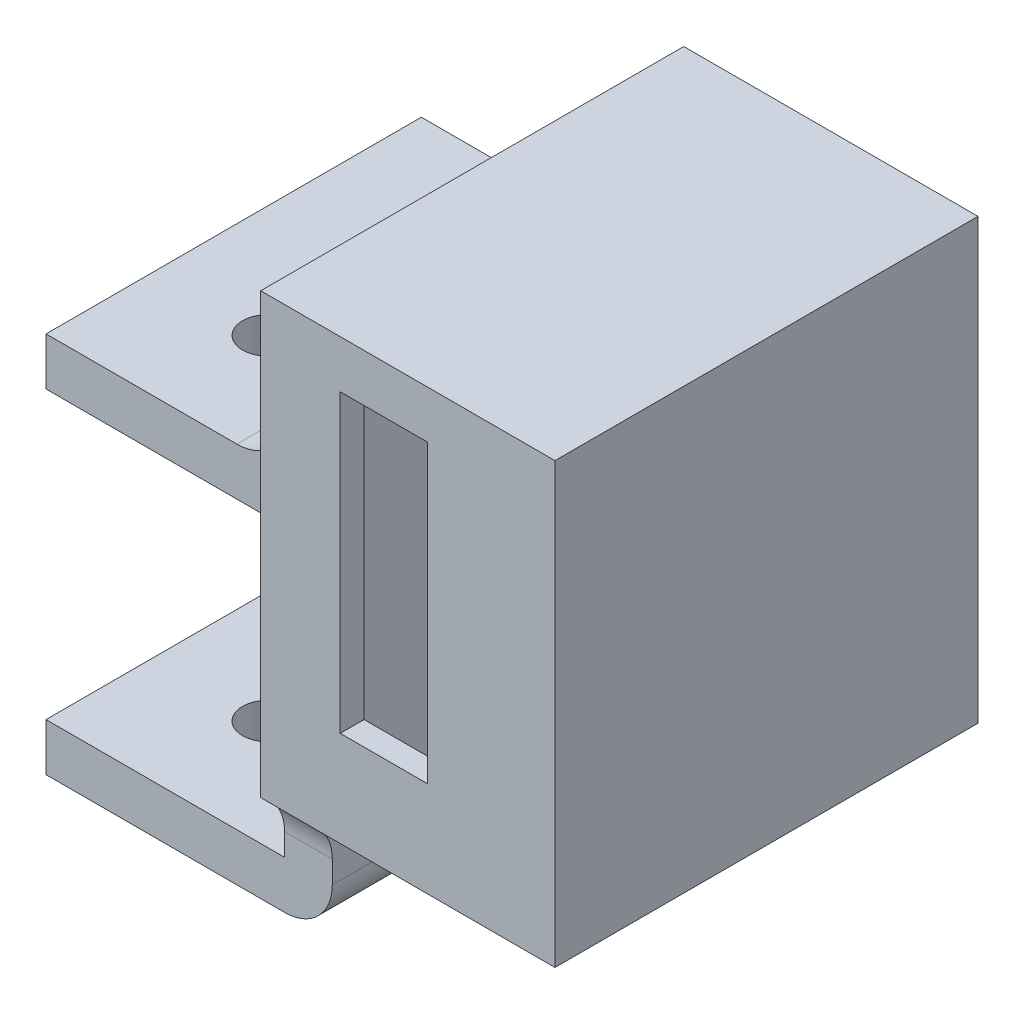
ISO-10303-21;
HEADER;
FILE_DESCRIPTION(('STEP AP214'),'2;1');
FILE_NAME('part.step','',(''),(''),'','','');
FILE_SCHEMA(('AUTOMOTIVE_DESIGN { 1 0 10303 214 1 1 1 1 }'));
ENDSEC;
DATA;
#1=APPLICATION_CONTEXT('core data for automotive mechanical design processes');
#2=APPLICATION_PROTOCOL_DEFINITION('international standard','automotive_design',2000,#1);
#3=PRODUCT_CONTEXT('',#1,'mechanical');
#4=PRODUCT('Part','Part','',(#3));
#5=PRODUCT_RELATED_PRODUCT_CATEGORY('part','',(#4));
#6=PRODUCT_DEFINITION_FORMATION('','',#4);
#7=PRODUCT_DEFINITION_CONTEXT('part definition',#1,'design');
#8=PRODUCT_DEFINITION('design','',#6,#7);
#9=PRODUCT_DEFINITION_SHAPE('','',#8);
#10=(LENGTH_UNIT() NAMED_UNIT(*) SI_UNIT(.MILLI.,.METRE.));
#11=(NAMED_UNIT(*) PLANE_ANGLE_UNIT() SI_UNIT($,.RADIAN.));
#12=(NAMED_UNIT(*) SI_UNIT($,.STERADIAN.) SOLID_ANGLE_UNIT());
#13=UNCERTAINTY_MEASURE_WITH_UNIT(LENGTH_MEASURE(1.E-05),#10,'distance_accuracy_value','');
#14=(GEOMETRIC_REPRESENTATION_CONTEXT(3) GLOBAL_UNCERTAINTY_ASSIGNED_CONTEXT((#13)) GLOBAL_UNIT_ASSIGNED_CONTEXT((#10,
#11,#12)) REPRESENTATION_CONTEXT('',''));
#15=CARTESIAN_POINT('',(0.,0.,0.));
#16=DIRECTION('',(0.,0.,1.));
#17=DIRECTION('',(1.,0.,0.));
#18=AXIS2_PLACEMENT_3D('',#15,#16,#17);
#19=CARTESIAN_POINT('',(0.,0.,0.));
#20=DIRECTION('',(-1.,0.,0.));
#21=DIRECTION('',(0.,0.,1.));
#22=AXIS2_PLACEMENT_3D('',#19,#20,#21);
#23=PLANE('',#22);
#24=DIRECTION('',(0.,-1.,0.));
#25=VECTOR('',#24,1.);
#26=CARTESIAN_POINT('',(0.,-20.8,-11.8));
#27=LINE('',#26,#25);
#28=CARTESIAN_POINT('',(0.,-16.3980762113533,-11.8));
#29=VERTEX_POINT('',#28);
#30=CARTESIAN_POINT('',(0.,-17.8,-11.8));
#31=VERTEX_POINT('',#30);
#32=EDGE_CURVE('E400',#29,#31,#27,.T.);
#33=ORIENTED_EDGE('',*,*,#32,.F.);
#34=CARTESIAN_POINT('',(0.,-16.3980762113533,-14.8));
#35=DIRECTION('',(-1.,0.,0.));
#36=DIRECTION('',(0.,0.,1.));
#37=AXIS2_PLACEMENT_3D('',#34,#35,#36);
#38=CIRCLE('',#37,3.);
#39=CARTESIAN_POINT('',(0.,-13.8,-13.3));
#40=VERTEX_POINT('',#39);
#41=EDGE_CURVE('E356',#29,#40,#38,.T.);
#42=ORIENTED_EDGE('',*,*,#41,.T.);
#43=DIRECTION('',(0.,0.,-1.));
#44=VECTOR('',#43,1.);
#45=CARTESIAN_POINT('',(0.,-13.8,0.));
#46=LINE('',#45,#44);
#47=CARTESIAN_POINT('',(0.,-13.8,-11.8));
#48=VERTEX_POINT('',#47);
#49=EDGE_CURVE('E353',#48,#40,#46,.T.);
#50=ORIENTED_EDGE('',*,*,#49,.F.);
#51=DIRECTION('',(0.,1.,0.));
#52=VECTOR('',#51,1.);
#53=CARTESIAN_POINT('',(0.,-12.3,-11.8));
#54=LINE('',#53,#52);
#55=CARTESIAN_POINT('',(0.,12.3,-11.8));
#56=VERTEX_POINT('',#55);
#57=EDGE_CURVE('E299',#48,#56,#54,.T.);
#58=ORIENTED_EDGE('',*,*,#57,.T.);
#59=DIRECTION('',(0.,0.,1.));
#60=VECTOR('',#59,1.);
#61=CARTESIAN_POINT('',(0.,12.3,11.8));
#62=LINE('',#61,#60);
#63=CARTESIAN_POINT('',(0.,12.3,11.8));
#64=VERTEX_POINT('',#63);
#65=EDGE_CURVE('E310',#56,#64,#62,.T.);
#66=ORIENTED_EDGE('',*,*,#65,.T.);
#67=DIRECTION('',(0.,-1.,0.));
#68=VECTOR('',#67,1.);
#69=CARTESIAN_POINT('',(0.,-12.3,11.8));
#70=LINE('',#69,#68);
#71=CARTESIAN_POINT('',(0.,-13.8,11.8));
#72=VERTEX_POINT('',#71);
#73=EDGE_CURVE('E303',#64,#72,#70,.T.);
#74=ORIENTED_EDGE('',*,*,#73,.T.);
#75=DIRECTION('',(0.,0.,-1.));
#76=VECTOR('',#75,1.);
#77=CARTESIAN_POINT('',(0.,-13.8,0.));
#78=LINE('',#77,#76);
#79=CARTESIAN_POINT('',(0.,-13.8,13.3));
#80=VERTEX_POINT('',#79);
#81=EDGE_CURVE('E344',#80,#72,#78,.T.);
#82=ORIENTED_EDGE('',*,*,#81,.F.);
#83=CARTESIAN_POINT('',(0.,-16.3980762113533,14.8));
#84=DIRECTION('',(-1.,0.,0.));
#85=DIRECTION('',(0.,0.,1.));
#86=AXIS2_PLACEMENT_3D('',#83,#84,#85);
#87=CIRCLE('',#86,3.);
#88=CARTESIAN_POINT('',(0.,-16.3980762113533,11.8));
#89=VERTEX_POINT('',#88);
#90=EDGE_CURVE('E348',#80,#89,#87,.T.);
#91=ORIENTED_EDGE('',*,*,#90,.T.);
#92=DIRECTION('',(0.,1.,0.));
#93=VECTOR('',#92,1.);
#94=CARTESIAN_POINT('',(0.,-13.8,11.8));
#95=LINE('',#94,#93);
#96=CARTESIAN_POINT('',(0.,-17.8,11.8));
#97=VERTEX_POINT('',#96);
#98=EDGE_CURVE('E229',#97,#89,#95,.T.);
#99=ORIENTED_EDGE('',*,*,#98,.F.);
#100=DIRECTION('',(0.,0.,1.));
#101=VECTOR('',#100,1.);
#102=CARTESIAN_POINT('',(0.,-17.8,0.));
#103=LINE('',#102,#101);
#104=EDGE_CURVE('E335',#97,#31,#103,.F.);
#105=ORIENTED_EDGE('',*,*,#104,.T.);
#106=EDGE_LOOP('',(#33,#42,#50,#58,#66,#74,#82,#91,#99,#105));
#107=FACE_BOUND('',#106,.T.);
#108=ADVANCED_FACE('F35',(#107),#23,.F.);
#109=CARTESIAN_POINT('',(-3.,-17.8,0.));
#110=DIRECTION('',(0.,0.,1.));
#111=DIRECTION('',(1.,0.,0.));
#112=AXIS2_PLACEMENT_3D('',#109,#110,#111);
#113=CYLINDRICAL_SURFACE('',#112,3.);
#114=DIRECTION('',(0.,0.,1.));
#115=VECTOR('',#114,1.);
#116=CARTESIAN_POINT('',(-3.,-20.8,0.));
#117=LINE('',#116,#115);
#118=CARTESIAN_POINT('',(-3.,-20.8,-11.8));
#119=VERTEX_POINT('',#118);
#120=CARTESIAN_POINT('',(-3.,-20.8,11.8));
#121=VERTEX_POINT('',#120);
#122=EDGE_CURVE('E332',#119,#121,#117,.T.);
#123=ORIENTED_EDGE('',*,*,#122,.F.);
#124=CARTESIAN_POINT('',(-3.,-17.8,-11.8));
#125=DIRECTION('',(0.,0.,-1.));
#126=DIRECTION('',(-1.,0.,0.));
#127=AXIS2_PLACEMENT_3D('',#124,#125,#126);
#128=CIRCLE('',#127,3.);
#129=EDGE_CURVE('E402',#119,#31,#128,.F.);
#130=ORIENTED_EDGE('',*,*,#129,.T.);
#131=ORIENTED_EDGE('',*,*,#104,.F.);
#132=CARTESIAN_POINT('',(-3.,-17.8,11.8));
#133=DIRECTION('',(0.,0.,1.));
#134=DIRECTION('',(1.,0.,0.));
#135=AXIS2_PLACEMENT_3D('',#132,#133,#134);
#136=CIRCLE('',#135,3.);
#137=EDGE_CURVE('E338',#97,#121,#136,.F.);
#138=ORIENTED_EDGE('',*,*,#137,.T.);
#139=EDGE_LOOP('',(#123,#130,#131,#138));
#140=FACE_BOUND('',#139,.T.);
#141=ADVANCED_FACE('F468',(#140),#113,.T.);
#142=CARTESIAN_POINT('',(-3.,0.,0.));
#143=DIRECTION('',(-1.,0.,0.));
#144=DIRECTION('',(0.,0.,1.));
#145=AXIS2_PLACEMENT_3D('',#142,#143,#144);
#146=PLANE('',#145);
#147=DIRECTION('',(0.,-1.,0.));
#148=VECTOR('',#147,1.);
#149=CARTESIAN_POINT('',(-3.,13.8,-13.3));
#150=LINE('',#149,#148);
#151=CARTESIAN_POINT('',(-3.,13.8,-13.3));
#152=VERTEX_POINT('',#151);
#153=CARTESIAN_POINT('',(-3.00000000000003,-13.8,-13.3));
#154=VERTEX_POINT('',#153);
#155=EDGE_CURVE('E291',#152,#154,#150,.T.);
#156=ORIENTED_EDGE('',*,*,#155,.T.);
#157=CARTESIAN_POINT('',(-3.,-16.3980762113533,-14.8));
#158=DIRECTION('',(-1.,0.,0.));
#159=DIRECTION('',(0.,0.,1.));
#160=AXIS2_PLACEMENT_3D('',#157,#158,#159);
#161=CIRCLE('',#160,3.);
#162=CARTESIAN_POINT('',(-3.00000000000003,-16.3980762113533,-11.8));
#163=VERTEX_POINT('',#162);
#164=EDGE_CURVE('E358',#154,#163,#161,.F.);
#165=ORIENTED_EDGE('',*,*,#164,.T.);
#166=DIRECTION('',(0.,1.,0.));
#167=VECTOR('',#166,1.);
#168=CARTESIAN_POINT('',(-3.00000000000003,-20.8,-11.8));
#169=LINE('',#168,#167);
#170=CARTESIAN_POINT('',(-3.00000000000003,-17.8,-11.8));
#171=VERTEX_POINT('',#170);
#172=EDGE_CURVE('E397',#171,#163,#169,.T.);
#173=ORIENTED_EDGE('',*,*,#172,.F.);
#174=DIRECTION('',(0.,0.,1.));
#175=VECTOR('',#174,1.);
#176=CARTESIAN_POINT('',(-3.,-17.8,-13.3));
#177=LINE('',#176,#175);
#178=CARTESIAN_POINT('',(-3.,-17.8,11.8));
#179=VERTEX_POINT('',#178);
#180=EDGE_CURVE('E271',#171,#179,#177,.T.);
#181=ORIENTED_EDGE('',*,*,#180,.T.);
#182=DIRECTION('',(0.,-1.,0.));
#183=VECTOR('',#182,1.);
#184=CARTESIAN_POINT('',(-3.,-13.8,11.8));
#185=LINE('',#184,#183);
#186=CARTESIAN_POINT('',(-3.,-16.3980762113533,11.8));
#187=VERTEX_POINT('',#186);
#188=EDGE_CURVE('E417',#187,#179,#185,.T.);
#189=ORIENTED_EDGE('',*,*,#188,.F.);
#190=CARTESIAN_POINT('',(-3.,-16.3980762113533,14.8));
#191=DIRECTION('',(-1.,0.,0.));
#192=DIRECTION('',(0.,0.,1.));
#193=AXIS2_PLACEMENT_3D('',#190,#191,#192);
#194=CIRCLE('',#193,3.);
#195=CARTESIAN_POINT('',(-3.,-13.8,13.3));
#196=VERTEX_POINT('',#195);
#197=EDGE_CURVE('E346',#187,#196,#194,.F.);
#198=ORIENTED_EDGE('',*,*,#197,.T.);
#199=DIRECTION('',(0.,1.,0.));
#200=VECTOR('',#199,1.);
#201=CARTESIAN_POINT('',(-3.,13.8,13.3));
#202=LINE('',#201,#200);
#203=CARTESIAN_POINT('',(-3.,13.8,13.3));
#204=VERTEX_POINT('',#203);
#205=EDGE_CURVE('E294',#196,#204,#202,.T.);
#206=ORIENTED_EDGE('',*,*,#205,.T.);
#207=DIRECTION('',(0.,0.,-1.));
#208=VECTOR('',#207,1.);
#209=CARTESIAN_POINT('',(-3.,13.8,-13.3));
#210=LINE('',#209,#208);
#211=EDGE_CURVE('E296',#204,#152,#210,.T.);
#212=ORIENTED_EDGE('',*,*,#211,.T.);
#213=EDGE_LOOP('',(#156,#165,#173,#181,#189,#198,#206,#212));
#214=FACE_BOUND('',#213,.T.);
#215=DIRECTION('',(0.,-1.,0.));
#216=VECTOR('',#215,1.);
#217=CARTESIAN_POINT('',(-3.,3.19999999999999,-11.8));
#218=LINE('',#217,#216);
#219=CARTESIAN_POINT('',(-3.,6.19999999999999,-11.8));
#220=VERTEX_POINT('',#219);
#221=CARTESIAN_POINT('',(-3.,0.199999999999994,-11.8));
#222=VERTEX_POINT('',#221);
#223=EDGE_CURVE('E406',#220,#222,#218,.T.);
#224=ORIENTED_EDGE('',*,*,#223,.F.);
#225=DIRECTION('',(0.,0.,-1.));
#226=VECTOR('',#225,1.);
#227=CARTESIAN_POINT('',(-3.,6.19999999999999,11.8));
#228=LINE('',#227,#226);
#229=CARTESIAN_POINT('',(-3.,6.19999999999999,11.8));
#230=VERTEX_POINT('',#229);
#231=EDGE_CURVE('E362',#220,#230,#228,.F.);
#232=ORIENTED_EDGE('',*,*,#231,.T.);
#233=DIRECTION('',(0.,1.,0.));
#234=VECTOR('',#233,1.);
#235=CARTESIAN_POINT('',(-3.,3.19999999999999,11.8));
#236=LINE('',#235,#234);
#237=CARTESIAN_POINT('',(-3.,0.199999999999994,11.8));
#238=VERTEX_POINT('',#237);
#239=EDGE_CURVE('E225',#238,#230,#236,.T.);
#240=ORIENTED_EDGE('',*,*,#239,.F.);
#241=DIRECTION('',(0.,0.,1.));
#242=VECTOR('',#241,1.);
#243=CARTESIAN_POINT('',(-3.,0.199999999999995,-13.3));
#244=LINE('',#243,#242);
#245=EDGE_CURVE('E272',#222,#238,#244,.T.);
#246=ORIENTED_EDGE('',*,*,#245,.F.);
#247=EDGE_LOOP('',(#224,#232,#240,#246));
#248=FACE_BOUND('',#247,.T.);
#249=ADVANCED_FACE('F435',(#214,#248),#146,.T.);
#250=CARTESIAN_POINT('',(12.5,-13.8,13.3));
#251=DIRECTION('',(0.,1.,0.));
#252=DIRECTION('',(0.,0.,1.));
#253=AXIS2_PLACEMENT_3D('',#250,#251,#252);
#254=PLANE('',#253);
#255=DIRECTION('',(1.,0.,0.));
#256=VECTOR('',#255,1.);
#257=CARTESIAN_POINT('',(12.5,-13.8,-11.8));
#258=LINE('',#257,#256);
#259=CARTESIAN_POINT('',(12.5,-13.8,-11.8));
#260=VERTEX_POINT('',#259);
#261=EDGE_CURVE('E268',#48,#260,#258,.T.);
#262=ORIENTED_EDGE('',*,*,#261,.F.);
#263=ORIENTED_EDGE('',*,*,#49,.T.);
#264=DIRECTION('',(-1.,0.,0.));
#265=VECTOR('',#264,1.);
#266=CARTESIAN_POINT('',(12.5,-13.8,-13.3));
#267=LINE('',#266,#265);
#268=CARTESIAN_POINT('',(15.5,-13.8,-13.3));
#269=VERTEX_POINT('',#268);
#270=EDGE_CURVE('E320',#269,#40,#267,.T.);
#271=ORIENTED_EDGE('',*,*,#270,.F.);
#272=DIRECTION('',(0.,0.,-1.));
#273=VECTOR('',#272,1.);
#274=CARTESIAN_POINT('',(15.5,-13.8,13.3));
#275=LINE('',#274,#273);
#276=CARTESIAN_POINT('',(15.5,-13.8,13.3));
#277=VERTEX_POINT('',#276);
#278=EDGE_CURVE('E282',#277,#269,#275,.T.);
#279=ORIENTED_EDGE('',*,*,#278,.F.);
#280=DIRECTION('',(-1.,0.,0.));
#281=VECTOR('',#280,1.);
#282=CARTESIAN_POINT('',(12.5,-13.8,13.3));
#283=LINE('',#282,#281);
#284=EDGE_CURVE('E324',#277,#80,#283,.T.);
#285=ORIENTED_EDGE('',*,*,#284,.T.);
#286=ORIENTED_EDGE('',*,*,#81,.T.);
#287=DIRECTION('',(-1.,0.,0.));
#288=VECTOR('',#287,1.);
#289=CARTESIAN_POINT('',(12.5,-13.8,11.8));
#290=LINE('',#289,#288);
#291=CARTESIAN_POINT('',(12.5,-13.8,11.8));
#292=VERTEX_POINT('',#291);
#293=EDGE_CURVE('E265',#292,#72,#290,.T.);
#294=ORIENTED_EDGE('',*,*,#293,.F.);
#295=DIRECTION('',(0.,0.,1.));
#296=VECTOR('',#295,1.);
#297=CARTESIAN_POINT('',(12.5,-13.8,10.3));
#298=LINE('',#297,#296);
#299=EDGE_CURVE('E274',#260,#292,#298,.T.);
#300=ORIENTED_EDGE('',*,*,#299,.F.);
#301=EDGE_LOOP('',(#262,#263,#271,#279,#285,#286,#294,#300));
#302=FACE_BOUND('',#301,.T.);
#303=ADVANCED_FACE('F471',(#302),#254,.F.);
#304=CARTESIAN_POINT('',(12.5,12.3,11.8));
#305=DIRECTION('',(0.,-1.,0.));
#306=DIRECTION('',(0.,0.,-1.));
#307=AXIS2_PLACEMENT_3D('',#304,#305,#306);
#308=PLANE('',#307);
#309=ORIENTED_EDGE('',*,*,#65,.F.);
#310=DIRECTION('',(-1.,0.,0.));
#311=VECTOR('',#310,1.);
#312=CARTESIAN_POINT('',(12.5,12.3,-11.8));
#313=LINE('',#312,#311);
#314=CARTESIAN_POINT('',(12.5,12.3,-11.8));
#315=VERTEX_POINT('',#314);
#316=EDGE_CURVE('E316',#315,#56,#313,.T.);
#317=ORIENTED_EDGE('',*,*,#316,.F.);
#318=DIRECTION('',(0.,0.,1.));
#319=VECTOR('',#318,1.);
#320=CARTESIAN_POINT('',(12.5,12.3,11.8));
#321=LINE('',#320,#319);
#322=CARTESIAN_POINT('',(12.5,12.3,11.8));
#323=VERTEX_POINT('',#322);
#324=EDGE_CURVE('E302',#315,#323,#321,.T.);
#325=ORIENTED_EDGE('',*,*,#324,.T.);
#326=DIRECTION('',(-1.,0.,0.));
#327=VECTOR('',#326,1.);
#328=CARTESIAN_POINT('',(12.5,12.3,11.8));
#329=LINE('',#328,#327);
#330=EDGE_CURVE('E308',#323,#64,#329,.T.);
#331=ORIENTED_EDGE('',*,*,#330,.T.);
#332=EDGE_LOOP('',(#309,#317,#325,#331));
#333=FACE_BOUND('',#332,.T.);
#334=ADVANCED_FACE('F481',(#333),#308,.T.);
#335=CARTESIAN_POINT('',(12.5,-12.3,11.8));
#336=DIRECTION('',(0.,0.,-1.));
#337=DIRECTION('',(-1.,0.,0.));
#338=AXIS2_PLACEMENT_3D('',#335,#336,#337);
#339=PLANE('',#338);
#340=DIRECTION('',(0.,1.,0.));
#341=VECTOR('',#340,1.);
#342=CARTESIAN_POINT('',(2.,-12.3,11.8));
#343=LINE('',#342,#341);
#344=CARTESIAN_POINT('',(2.,-7.80000000000001,11.8));
#345=VERTEX_POINT('',#344);
#346=CARTESIAN_POINT('',(2.,10.8,11.8));
#347=VERTEX_POINT('',#346);
#348=EDGE_CURVE('E263',#345,#347,#343,.T.);
#349=ORIENTED_EDGE('',*,*,#348,.F.);
#350=DIRECTION('',(-1.,0.,0.));
#351=VECTOR('',#350,1.);
#352=CARTESIAN_POINT('',(12.5,-7.80000000000001,11.8));
#353=LINE('',#352,#351);
#354=CARTESIAN_POINT('',(7.5,-7.80000000000001,11.8));
#355=VERTEX_POINT('',#354);
#356=EDGE_CURVE('E250',#355,#345,#353,.T.);
#357=ORIENTED_EDGE('',*,*,#356,.F.);
#358=DIRECTION('',(0.,-1.,0.));
#359=VECTOR('',#358,1.);
#360=CARTESIAN_POINT('',(7.5,-12.3,11.8));
#361=LINE('',#360,#359);
#362=CARTESIAN_POINT('',(7.5,10.8,11.8));
#363=VERTEX_POINT('',#362);
#364=EDGE_CURVE('E258',#363,#355,#361,.T.);
#365=ORIENTED_EDGE('',*,*,#364,.F.);
#366=DIRECTION('',(1.,0.,0.));
#367=VECTOR('',#366,1.);
#368=CARTESIAN_POINT('',(12.5,10.8,11.8));
#369=LINE('',#368,#367);
#370=EDGE_CURVE('E261',#347,#363,#369,.T.);
#371=ORIENTED_EDGE('',*,*,#370,.F.);
#372=EDGE_LOOP('',(#349,#357,#365,#371));
#373=FACE_BOUND('',#372,.T.);
#374=DIRECTION('',(0.,-1.,0.));
#375=VECTOR('',#374,1.);
#376=CARTESIAN_POINT('',(12.5,-12.3,11.8));
#377=LINE('',#376,#375);
#378=EDGE_CURVE('E306',#323,#292,#377,.T.);
#379=ORIENTED_EDGE('',*,*,#378,.T.);
#380=ORIENTED_EDGE('',*,*,#293,.T.);
#381=ORIENTED_EDGE('',*,*,#73,.F.);
#382=ORIENTED_EDGE('',*,*,#330,.F.);
#383=EDGE_LOOP('',(#379,#380,#381,#382));
#384=FACE_BOUND('',#383,.T.);
#385=ADVANCED_FACE('F486',(#373,#384),#339,.T.);
#386=CARTESIAN_POINT('',(12.5,-12.3,-11.8));
#387=DIRECTION('',(0.,0.,1.));
#388=DIRECTION('',(1.,0.,0.));
#389=AXIS2_PLACEMENT_3D('',#386,#387,#388);
#390=PLANE('',#389);
#391=ORIENTED_EDGE('',*,*,#316,.T.);
#392=ORIENTED_EDGE('',*,*,#57,.F.);
#393=ORIENTED_EDGE('',*,*,#261,.T.);
#394=DIRECTION('',(0.,1.,0.));
#395=VECTOR('',#394,1.);
#396=CARTESIAN_POINT('',(12.5,-12.3,-11.8));
#397=LINE('',#396,#395);
#398=EDGE_CURVE('E300',#260,#315,#397,.T.);
#399=ORIENTED_EDGE('',*,*,#398,.T.);
#400=EDGE_LOOP('',(#391,#392,#393,#399));
#401=FACE_BOUND('',#400,.T.);
#402=ADVANCED_FACE('F477',(#401),#390,.T.);
#403=CARTESIAN_POINT('',(12.5,0.,0.));
#404=DIRECTION('',(1.,0.,0.));
#405=DIRECTION('',(0.,0.,-1.));
#406=AXIS2_PLACEMENT_3D('',#403,#404,#405);
#407=PLANE('',#406);
#408=ORIENTED_EDGE('',*,*,#398,.F.);
#409=ORIENTED_EDGE('',*,*,#299,.T.);
#410=ORIENTED_EDGE('',*,*,#378,.F.);
#411=ORIENTED_EDGE('',*,*,#324,.F.);
#412=EDGE_LOOP('',(#408,#409,#410,#411));
#413=FACE_BOUND('',#412,.T.);
#414=ADVANCED_FACE('F514',(#413),#407,.F.);
#415=CARTESIAN_POINT('',(12.5,-13.8,-13.3));
#416=DIRECTION('',(0.,0.,1.));
#417=DIRECTION('',(1.,0.,0.));
#418=AXIS2_PLACEMENT_3D('',#415,#416,#417);
#419=PLANE('',#418);
#420=ORIENTED_EDGE('',*,*,#270,.T.);
#421=EDGE_CURVE('E319',#40,#154,#267,.T.);
#422=ORIENTED_EDGE('',*,*,#421,.T.);
#423=ORIENTED_EDGE('',*,*,#155,.F.);
#424=DIRECTION('',(-1.,0.,0.));
#425=VECTOR('',#424,1.);
#426=CARTESIAN_POINT('',(12.5,13.8,-13.3));
#427=LINE('',#426,#425);
#428=CARTESIAN_POINT('',(15.5,13.8,-13.3));
#429=VERTEX_POINT('',#428);
#430=EDGE_CURVE('E330',#429,#152,#427,.T.);
#431=ORIENTED_EDGE('',*,*,#430,.F.);
#432=DIRECTION('',(0.,1.,0.));
#433=VECTOR('',#432,1.);
#434=CARTESIAN_POINT('',(15.5,13.8,-13.3));
#435=LINE('',#434,#433);
#436=EDGE_CURVE('E285',#269,#429,#435,.T.);
#437=ORIENTED_EDGE('',*,*,#436,.F.);
#438=EDGE_LOOP('',(#420,#422,#423,#431,#437));
#439=FACE_BOUND('',#438,.T.);
#440=ADVANCED_FACE('F447',(#439),#419,.F.);
#441=CARTESIAN_POINT('',(12.5,13.8,13.3));
#442=DIRECTION('',(0.,-1.,0.));
#443=DIRECTION('',(0.,0.,-1.));
#444=AXIS2_PLACEMENT_3D('',#441,#442,#443);
#445=PLANE('',#444);
#446=ORIENTED_EDGE('',*,*,#430,.T.);
#447=ORIENTED_EDGE('',*,*,#211,.F.);
#448=DIRECTION('',(-1.,0.,0.));
#449=VECTOR('',#448,1.);
#450=CARTESIAN_POINT('',(12.5,13.8,13.3));
#451=LINE('',#450,#449);
#452=CARTESIAN_POINT('',(15.5,13.8,13.3));
#453=VERTEX_POINT('',#452);
#454=EDGE_CURVE('E327',#453,#204,#451,.T.);
#455=ORIENTED_EDGE('',*,*,#454,.F.);
#456=DIRECTION('',(0.,0.,1.));
#457=VECTOR('',#456,1.);
#458=CARTESIAN_POINT('',(15.5,13.8,13.3));
#459=LINE('',#458,#457);
#460=EDGE_CURVE('E288',#429,#453,#459,.T.);
#461=ORIENTED_EDGE('',*,*,#460,.F.);
#462=EDGE_LOOP('',(#446,#447,#455,#461));
#463=FACE_BOUND('',#462,.T.);
#464=ADVANCED_FACE('F443',(#463),#445,.F.);
#465=CARTESIAN_POINT('',(12.5,-13.8,13.3));
#466=DIRECTION('',(0.,0.,-1.));
#467=DIRECTION('',(-1.,0.,0.));
#468=AXIS2_PLACEMENT_3D('',#465,#466,#467);
#469=PLANE('',#468);
#470=DIRECTION('',(1.,0.,0.));
#471=VECTOR('',#470,1.);
#472=CARTESIAN_POINT('',(2.,-7.80000000000001,13.3));
#473=LINE('',#472,#471);
#474=CARTESIAN_POINT('',(2.,-7.80000000000001,13.3));
#475=VERTEX_POINT('',#474);
#476=CARTESIAN_POINT('',(7.5,-7.80000000000001,13.3));
#477=VERTEX_POINT('',#476);
#478=EDGE_CURVE('E238',#475,#477,#473,.T.);
#479=ORIENTED_EDGE('',*,*,#478,.F.);
#480=DIRECTION('',(0.,-1.,0.));
#481=VECTOR('',#480,1.);
#482=CARTESIAN_POINT('',(2.,10.8,13.3));
#483=LINE('',#482,#481);
#484=CARTESIAN_POINT('',(2.,10.8,13.3));
#485=VERTEX_POINT('',#484);
#486=EDGE_CURVE('E236',#485,#475,#483,.T.);
#487=ORIENTED_EDGE('',*,*,#486,.F.);
#488=DIRECTION('',(-1.,0.,0.));
#489=VECTOR('',#488,1.);
#490=CARTESIAN_POINT('',(2.,10.8,13.3));
#491=LINE('',#490,#489);
#492=CARTESIAN_POINT('',(7.5,10.8,13.3));
#493=VERTEX_POINT('',#492);
#494=EDGE_CURVE('E244',#493,#485,#491,.T.);
#495=ORIENTED_EDGE('',*,*,#494,.F.);
#496=DIRECTION('',(0.,1.,0.));
#497=VECTOR('',#496,1.);
#498=CARTESIAN_POINT('',(7.5,10.8,13.3));
#499=LINE('',#498,#497);
#500=EDGE_CURVE('E241',#477,#493,#499,.T.);
#501=ORIENTED_EDGE('',*,*,#500,.F.);
#502=EDGE_LOOP('',(#479,#487,#495,#501));
#503=FACE_BOUND('',#502,.T.);
#504=ORIENTED_EDGE('',*,*,#205,.F.);
#505=EDGE_CURVE('E323',#80,#196,#283,.T.);
#506=ORIENTED_EDGE('',*,*,#505,.F.);
#507=ORIENTED_EDGE('',*,*,#284,.F.);
#508=DIRECTION('',(0.,-1.,0.));
#509=VECTOR('',#508,1.);
#510=CARTESIAN_POINT('',(15.5,13.8,13.3));
#511=LINE('',#510,#509);
#512=EDGE_CURVE('E279',#453,#277,#511,.T.);
#513=ORIENTED_EDGE('',*,*,#512,.F.);
#514=ORIENTED_EDGE('',*,*,#454,.T.);
#515=EDGE_LOOP('',(#504,#506,#507,#513,#514));
#516=FACE_BOUND('',#515,.T.);
#517=ADVANCED_FACE('F438',(#503,#516),#469,.F.);
#518=CARTESIAN_POINT('',(15.5,0.,0.));
#519=DIRECTION('',(1.,0.,0.));
#520=DIRECTION('',(0.,0.,-1.));
#521=AXIS2_PLACEMENT_3D('',#518,#519,#520);
#522=PLANE('',#521);
#523=ORIENTED_EDGE('',*,*,#512,.T.);
#524=ORIENTED_EDGE('',*,*,#278,.T.);
#525=ORIENTED_EDGE('',*,*,#436,.T.);
#526=ORIENTED_EDGE('',*,*,#460,.T.);
#527=EDGE_LOOP('',(#523,#524,#525,#526));
#528=FACE_BOUND('',#527,.T.);
#529=ADVANCED_FACE('F488',(#528),#522,.T.);
#530=CARTESIAN_POINT('',(0.,3.19999999999999,0.));
#531=DIRECTION('',(0.,1.,0.));
#532=DIRECTION('',(0.,0.,1.));
#533=AXIS2_PLACEMENT_3D('',#530,#531,#532);
#534=PLANE('',#533);
#535=CARTESIAN_POINT('',(-10.94,3.19999999999999,4.90050775661674));
#536=DIRECTION('',(0.,-1.,0.));
#537=DIRECTION('',(0.,0.,-1.));
#538=AXIS2_PLACEMENT_3D('',#535,#536,#537);
#539=CIRCLE('',#538,1.6);
#540=CARTESIAN_POINT('',(-10.94,3.19999999999999,3.30050775661674));
#541=VERTEX_POINT('',#540);
#542=EDGE_CURVE('E371',#541,#541,#539,.T.);
#543=ORIENTED_EDGE('',*,*,#542,.T.);
#544=EDGE_LOOP('',(#543));
#545=FACE_BOUND('',#544,.T.);
#546=CARTESIAN_POINT('',(-10.94,3.19999999999999,-4.83670463138572));
#547=DIRECTION('',(0.,-1.,0.));
#548=DIRECTION('',(0.,0.,-1.));
#549=AXIS2_PLACEMENT_3D('',#546,#547,#548);
#550=CIRCLE('',#549,1.6);
#551=CARTESIAN_POINT('',(-10.94,3.19999999999999,-6.43670463138572));
#552=VERTEX_POINT('',#551);
#553=EDGE_CURVE('E382',#552,#552,#550,.T.);
#554=ORIENTED_EDGE('',*,*,#553,.T.);
#555=EDGE_LOOP('',(#554));
#556=FACE_BOUND('',#555,.T.);
#557=DIRECTION('',(0.,0.,1.));
#558=VECTOR('',#557,1.);
#559=CARTESIAN_POINT('',(-18.,3.19999999999999,11.8));
#560=LINE('',#559,#558);
#561=CARTESIAN_POINT('',(-18.,3.19999999999999,-11.8));
#562=VERTEX_POINT('',#561);
#563=CARTESIAN_POINT('',(-18.,3.19999999999999,11.8));
#564=VERTEX_POINT('',#563);
#565=EDGE_CURVE('E52',#562,#564,#560,.T.);
#566=ORIENTED_EDGE('',*,*,#565,.T.);
#567=DIRECTION('',(-1.,0.,0.));
#568=VECTOR('',#567,1.);
#569=CARTESIAN_POINT('',(-3.,3.19999999999999,11.8));
#570=LINE('',#569,#568);
#571=CARTESIAN_POINT('',(-6.,3.19999999999999,11.8));
#572=VERTEX_POINT('',#571);
#573=EDGE_CURVE('E216',#572,#564,#570,.T.);
#574=ORIENTED_EDGE('',*,*,#573,.F.);
#575=DIRECTION('',(0.,0.,-1.));
#576=VECTOR('',#575,1.);
#577=CARTESIAN_POINT('',(-6.,3.19999999999999,-11.8));
#578=LINE('',#577,#576);
#579=CARTESIAN_POINT('',(-6.,3.19999999999999,-11.8));
#580=VERTEX_POINT('',#579);
#581=EDGE_CURVE('E360',#572,#580,#578,.T.);
#582=ORIENTED_EDGE('',*,*,#581,.T.);
#583=DIRECTION('',(1.,0.,0.));
#584=VECTOR('',#583,1.);
#585=CARTESIAN_POINT('',(-23.,3.19999999999999,-11.8));
#586=LINE('',#585,#584);
#587=EDGE_CURVE('E218',#562,#580,#586,.T.);
#588=ORIENTED_EDGE('',*,*,#587,.F.);
#589=EDGE_LOOP('',(#566,#574,#582,#588));
#590=FACE_BOUND('',#589,.T.);
#591=ADVANCED_FACE('F214',(#545,#556,#590),#534,.T.);
#592=CARTESIAN_POINT('',(0.,-20.8,0.));
#593=DIRECTION('',(0.,1.,0.));
#594=DIRECTION('',(0.,0.,1.));
#595=AXIS2_PLACEMENT_3D('',#592,#593,#594);
#596=PLANE('',#595);
#597=CARTESIAN_POINT('',(-10.94,-20.8,4.90050775661674));
#598=DIRECTION('',(0.,-1.,0.));
#599=DIRECTION('',(0.,0.,-1.));
#600=AXIS2_PLACEMENT_3D('',#597,#598,#599);
#601=CIRCLE('',#600,1.6);
#602=CARTESIAN_POINT('',(-10.94,-20.8,3.30050775661674));
#603=VERTEX_POINT('',#602);
#604=EDGE_CURVE('E377',#603,#603,#601,.T.);
#605=ORIENTED_EDGE('',*,*,#604,.F.);
#606=EDGE_LOOP('',(#605));
#607=FACE_BOUND('',#606,.T.);
#608=CARTESIAN_POINT('',(-10.94,-20.8,-4.83670463138572));
#609=DIRECTION('',(0.,-1.,0.));
#610=DIRECTION('',(0.,0.,-1.));
#611=AXIS2_PLACEMENT_3D('',#608,#609,#610);
#612=CIRCLE('',#611,1.6);
#613=CARTESIAN_POINT('',(-10.94,-20.8,-6.43670463138572));
#614=VERTEX_POINT('',#613);
#615=EDGE_CURVE('E387',#614,#614,#612,.T.);
#616=ORIENTED_EDGE('',*,*,#615,.F.);
#617=EDGE_LOOP('',(#616));
#618=FACE_BOUND('',#617,.T.);
#619=DIRECTION('',(1.,0.,0.));
#620=VECTOR('',#619,1.);
#621=CARTESIAN_POINT('',(-3.,-20.8,11.8));
#622=LINE('',#621,#620);
#623=CARTESIAN_POINT('',(-18.,-20.8,11.8));
#624=VERTEX_POINT('',#623);
#625=EDGE_CURVE('E224',#624,#121,#622,.T.);
#626=ORIENTED_EDGE('',*,*,#625,.F.);
#627=DIRECTION('',(0.,0.,1.));
#628=VECTOR('',#627,1.);
#629=CARTESIAN_POINT('',(-18.,-20.8,11.8));
#630=LINE('',#629,#628);
#631=CARTESIAN_POINT('',(-18.,-20.8,-11.8));
#632=VERTEX_POINT('',#631);
#633=EDGE_CURVE('E220',#632,#624,#630,.T.);
#634=ORIENTED_EDGE('',*,*,#633,.F.);
#635=DIRECTION('',(-1.,0.,0.));
#636=VECTOR('',#635,1.);
#637=CARTESIAN_POINT('',(-23.,-20.8,-11.8));
#638=LINE('',#637,#636);
#639=EDGE_CURVE('E409',#119,#632,#638,.T.);
#640=ORIENTED_EDGE('',*,*,#639,.F.);
#641=ORIENTED_EDGE('',*,*,#122,.T.);
#642=EDGE_LOOP('',(#626,#634,#640,#641));
#643=FACE_BOUND('',#642,.T.);
#644=ADVANCED_FACE('F464',(#607,#618,#643),#596,.F.);
#645=CARTESIAN_POINT('',(-12.54,0.199999999999994,-13.3));
#646=DIRECTION('',(0.,1.,0.));
#647=DIRECTION('',(-1.,0.,0.));
#648=AXIS2_PLACEMENT_3D('',#645,#646,#647);
#649=PLANE('',#648);
#650=CARTESIAN_POINT('',(-10.94,0.199999999999994,4.90050775661674));
#651=DIRECTION('',(0.,1.,0.));
#652=DIRECTION('',(-1.,0.,0.));
#653=AXIS2_PLACEMENT_3D('',#650,#651,#652);
#654=CIRCLE('',#653,1.6);
#655=CARTESIAN_POINT('',(-12.54,0.199999999999994,4.90050775661674));
#656=VERTEX_POINT('',#655);
#657=EDGE_CURVE('E390',#656,#656,#654,.T.);
#658=ORIENTED_EDGE('',*,*,#657,.T.);
#659=EDGE_LOOP('',(#658));
#660=FACE_BOUND('',#659,.T.);
#661=CARTESIAN_POINT('',(-10.94,0.199999999999994,-4.83670463138572));
#662=DIRECTION('',(0.,1.,0.));
#663=DIRECTION('',(-1.,0.,0.));
#664=AXIS2_PLACEMENT_3D('',#661,#662,#663);
#665=CIRCLE('',#664,1.6);
#666=CARTESIAN_POINT('',(-12.54,0.199999999999994,-4.83670463138572));
#667=VERTEX_POINT('',#666);
#668=EDGE_CURVE('E370',#667,#667,#665,.T.);
#669=ORIENTED_EDGE('',*,*,#668,.T.);
#670=EDGE_LOOP('',(#669));
#671=FACE_BOUND('',#670,.T.);
#672=DIRECTION('',(-1.,0.,0.));
#673=VECTOR('',#672,1.);
#674=CARTESIAN_POINT('',(-12.54,0.199999999999994,11.8));
#675=LINE('',#674,#673);
#676=CARTESIAN_POINT('',(-18.,0.199999999999994,11.8));
#677=VERTEX_POINT('',#676);
#678=EDGE_CURVE('E234',#238,#677,#675,.T.);
#679=ORIENTED_EDGE('',*,*,#678,.T.);
#680=DIRECTION('',(0.,0.,-1.));
#681=VECTOR('',#680,1.);
#682=CARTESIAN_POINT('',(-18.,0.199999999999994,-13.3));
#683=LINE('',#682,#681);
#684=CARTESIAN_POINT('',(-18.,0.199999999999994,-11.8));
#685=VERTEX_POINT('',#684);
#686=EDGE_CURVE('E204',#677,#685,#683,.T.);
#687=ORIENTED_EDGE('',*,*,#686,.T.);
#688=DIRECTION('',(1.,0.,0.));
#689=VECTOR('',#688,1.);
#690=CARTESIAN_POINT('',(-12.54,0.199999999999994,-11.8));
#691=LINE('',#690,#689);
#692=EDGE_CURVE('E415',#685,#222,#691,.T.);
#693=ORIENTED_EDGE('',*,*,#692,.T.);
#694=ORIENTED_EDGE('',*,*,#245,.T.);
#695=EDGE_LOOP('',(#679,#687,#693,#694));
#696=FACE_BOUND('',#695,.T.);
#697=ADVANCED_FACE('F539',(#660,#671,#696),#649,.F.);
#698=CARTESIAN_POINT('',(-12.54,-17.8,-13.3));
#699=DIRECTION('',(0.,-1.,0.));
#700=DIRECTION('',(0.,0.,-1.));
#701=AXIS2_PLACEMENT_3D('',#698,#699,#700);
#702=PLANE('',#701);
#703=CARTESIAN_POINT('',(-10.94,-17.8,4.90050775661674));
#704=DIRECTION('',(0.,-1.,0.));
#705=DIRECTION('',(0.,0.,-1.));
#706=AXIS2_PLACEMENT_3D('',#703,#704,#705);
#707=CIRCLE('',#706,1.6);
#708=CARTESIAN_POINT('',(-10.94,-17.8,3.30050775661674));
#709=VERTEX_POINT('',#708);
#710=EDGE_CURVE('E39',#709,#709,#707,.T.);
#711=ORIENTED_EDGE('',*,*,#710,.T.);
#712=EDGE_LOOP('',(#711));
#713=FACE_BOUND('',#712,.T.);
#714=CARTESIAN_POINT('',(-10.94,-17.8,-4.83670463138572));
#715=DIRECTION('',(0.,-1.,0.));
#716=DIRECTION('',(0.,0.,-1.));
#717=AXIS2_PLACEMENT_3D('',#714,#715,#716);
#718=CIRCLE('',#717,1.6);
#719=CARTESIAN_POINT('',(-10.94,-17.8,-6.43670463138572));
#720=VERTEX_POINT('',#719);
#721=EDGE_CURVE('E368',#720,#720,#718,.T.);
#722=ORIENTED_EDGE('',*,*,#721,.T.);
#723=EDGE_LOOP('',(#722));
#724=FACE_BOUND('',#723,.T.);
#725=DIRECTION('',(-1.,0.,0.));
#726=VECTOR('',#725,1.);
#727=CARTESIAN_POINT('',(-12.54,-17.8,-11.8));
#728=LINE('',#727,#726);
#729=CARTESIAN_POINT('',(-18.,-17.8,-11.8));
#730=VERTEX_POINT('',#729);
#731=EDGE_CURVE('E412',#171,#730,#728,.T.);
#732=ORIENTED_EDGE('',*,*,#731,.T.);
#733=DIRECTION('',(0.,0.,1.));
#734=VECTOR('',#733,1.);
#735=CARTESIAN_POINT('',(-18.,-17.8,-13.3));
#736=LINE('',#735,#734);
#737=CARTESIAN_POINT('',(-18.,-17.8,11.8));
#738=VERTEX_POINT('',#737);
#739=EDGE_CURVE('E60',#730,#738,#736,.T.);
#740=ORIENTED_EDGE('',*,*,#739,.T.);
#741=DIRECTION('',(1.,0.,0.));
#742=VECTOR('',#741,1.);
#743=CARTESIAN_POINT('',(-12.54,-17.8,11.8));
#744=LINE('',#743,#742);
#745=EDGE_CURVE('E227',#738,#179,#744,.T.);
#746=ORIENTED_EDGE('',*,*,#745,.T.);
#747=ORIENTED_EDGE('',*,*,#180,.F.);
#748=EDGE_LOOP('',(#732,#740,#746,#747));
#749=FACE_BOUND('',#748,.T.);
#750=ADVANCED_FACE('F459',(#713,#724,#749),#702,.F.);
#751=CARTESIAN_POINT('',(2.,10.8,10.3));
#752=DIRECTION('',(-1.,0.,0.));
#753=DIRECTION('',(0.,0.,1.));
#754=AXIS2_PLACEMENT_3D('',#751,#752,#753);
#755=PLANE('',#754);
#756=ORIENTED_EDGE('',*,*,#348,.T.);
#757=DIRECTION('',(0.,0.,1.));
#758=VECTOR('',#757,1.);
#759=CARTESIAN_POINT('',(2.,10.8,10.3));
#760=LINE('',#759,#758);
#761=EDGE_CURVE('E248',#347,#485,#760,.T.);
#762=ORIENTED_EDGE('',*,*,#761,.T.);
#763=ORIENTED_EDGE('',*,*,#486,.T.);
#764=DIRECTION('',(0.,0.,1.));
#765=VECTOR('',#764,1.);
#766=CARTESIAN_POINT('',(2.,-7.80000000000001,10.3));
#767=LINE('',#766,#765);
#768=EDGE_CURVE('E247',#345,#475,#767,.T.);
#769=ORIENTED_EDGE('',*,*,#768,.F.);
#770=EDGE_LOOP('',(#756,#762,#763,#769));
#771=FACE_BOUND('',#770,.T.);
#772=ADVANCED_FACE('F677',(#771),#755,.F.);
#773=CARTESIAN_POINT('',(2.,10.8,10.3));
#774=DIRECTION('',(0.,1.,0.));
#775=DIRECTION('',(0.,0.,1.));
#776=AXIS2_PLACEMENT_3D('',#773,#774,#775);
#777=PLANE('',#776);
#778=ORIENTED_EDGE('',*,*,#370,.T.);
#779=DIRECTION('',(0.,0.,1.));
#780=VECTOR('',#779,1.);
#781=CARTESIAN_POINT('',(7.5,10.8,10.3));
#782=LINE('',#781,#780);
#783=EDGE_CURVE('E251',#363,#493,#782,.T.);
#784=ORIENTED_EDGE('',*,*,#783,.T.);
#785=ORIENTED_EDGE('',*,*,#494,.T.);
#786=ORIENTED_EDGE('',*,*,#761,.F.);
#787=EDGE_LOOP('',(#778,#784,#785,#786));
#788=FACE_BOUND('',#787,.T.);
#789=ADVANCED_FACE('F724',(#788),#777,.F.);
#790=CARTESIAN_POINT('',(7.5,10.8,10.3));
#791=DIRECTION('',(1.,0.,0.));
#792=DIRECTION('',(0.,0.,-1.));
#793=AXIS2_PLACEMENT_3D('',#790,#791,#792);
#794=PLANE('',#793);
#795=ORIENTED_EDGE('',*,*,#364,.T.);
#796=DIRECTION('',(0.,0.,1.));
#797=VECTOR('',#796,1.);
#798=CARTESIAN_POINT('',(7.5,-7.80000000000001,10.3));
#799=LINE('',#798,#797);
#800=EDGE_CURVE('E253',#355,#477,#799,.T.);
#801=ORIENTED_EDGE('',*,*,#800,.T.);
#802=ORIENTED_EDGE('',*,*,#500,.T.);
#803=ORIENTED_EDGE('',*,*,#783,.F.);
#804=EDGE_LOOP('',(#795,#801,#802,#803));
#805=FACE_BOUND('',#804,.T.);
#806=ADVANCED_FACE('F727',(#805),#794,.F.);
#807=CARTESIAN_POINT('',(2.,-7.80000000000001,10.3));
#808=DIRECTION('',(0.,-1.,0.));
#809=DIRECTION('',(0.,0.,-1.));
#810=AXIS2_PLACEMENT_3D('',#807,#808,#809);
#811=PLANE('',#810);
#812=ORIENTED_EDGE('',*,*,#356,.T.);
#813=ORIENTED_EDGE('',*,*,#768,.T.);
#814=ORIENTED_EDGE('',*,*,#478,.T.);
#815=ORIENTED_EDGE('',*,*,#800,.F.);
#816=EDGE_LOOP('',(#812,#813,#814,#815));
#817=FACE_BOUND('',#816,.T.);
#818=ADVANCED_FACE('F731',(#817),#811,.F.);
#819=CARTESIAN_POINT('',(0.,0.,11.8));
#820=DIRECTION('',(0.,0.,-1.));
#821=DIRECTION('',(-1.,0.,0.));
#822=AXIS2_PLACEMENT_3D('',#819,#820,#821);
#823=PLANE('',#822);
#824=ORIENTED_EDGE('',*,*,#745,.F.);
#825=DIRECTION('',(0.,-1.,0.));
#826=VECTOR('',#825,1.);
#827=CARTESIAN_POINT('',(-18.,3.19999999999999,11.8));
#828=LINE('',#827,#826);
#829=EDGE_CURVE('E209',#738,#624,#828,.T.);
#830=ORIENTED_EDGE('',*,*,#829,.T.);
#831=ORIENTED_EDGE('',*,*,#625,.T.);
#832=ORIENTED_EDGE('',*,*,#137,.F.);
#833=ORIENTED_EDGE('',*,*,#98,.T.);
#834=DIRECTION('',(-1.,0.,0.));
#835=VECTOR('',#834,1.);
#836=CARTESIAN_POINT('',(0.,-16.3980762113533,11.8));
#837=LINE('',#836,#835);
#838=EDGE_CURVE('E341',#89,#187,#837,.T.);
#839=ORIENTED_EDGE('',*,*,#838,.T.);
#840=ORIENTED_EDGE('',*,*,#188,.T.);
#841=EDGE_LOOP('',(#824,#830,#831,#832,#833,#839,#840));
#842=FACE_BOUND('',#841,.T.);
#843=ADVANCED_FACE('F424',(#842),#823,.F.);
#844=ORIENTED_EDGE('',*,*,#573,.T.);
#845=EDGE_CURVE('E201',#564,#677,#828,.T.);
#846=ORIENTED_EDGE('',*,*,#845,.T.);
#847=ORIENTED_EDGE('',*,*,#678,.F.);
#848=ORIENTED_EDGE('',*,*,#239,.T.);
#849=CARTESIAN_POINT('',(-6.,6.19999999999999,11.8));
#850=DIRECTION('',(0.,0.,-1.));
#851=DIRECTION('',(-1.,0.,0.));
#852=AXIS2_PLACEMENT_3D('',#849,#850,#851);
#853=CIRCLE('',#852,3.);
#854=EDGE_CURVE('E44',#230,#572,#853,.T.);
#855=ORIENTED_EDGE('',*,*,#854,.T.);
#856=EDGE_LOOP('',(#844,#846,#847,#848,#855));
#857=FACE_BOUND('',#856,.T.);
#858=ADVANCED_FACE('F222',(#857),#823,.F.);
#859=CARTESIAN_POINT('',(0.,0.,-11.8));
#860=DIRECTION('',(0.,0.,1.));
#861=DIRECTION('',(1.,0.,0.));
#862=AXIS2_PLACEMENT_3D('',#859,#860,#861);
#863=PLANE('',#862);
#864=ORIENTED_EDGE('',*,*,#692,.F.);
#865=DIRECTION('',(0.,-1.,0.));
#866=VECTOR('',#865,1.);
#867=CARTESIAN_POINT('',(-18.,3.19999999999999,-11.8));
#868=LINE('',#867,#866);
#869=EDGE_CURVE('E219',#562,#685,#868,.T.);
#870=ORIENTED_EDGE('',*,*,#869,.F.);
#871=ORIENTED_EDGE('',*,*,#587,.T.);
#872=CARTESIAN_POINT('',(-6.,6.19999999999999,-11.8));
#873=DIRECTION('',(0.,0.,1.));
#874=DIRECTION('',(1.,0.,0.));
#875=AXIS2_PLACEMENT_3D('',#872,#873,#874);
#876=CIRCLE('',#875,3.);
#877=EDGE_CURVE('E365',#580,#220,#876,.T.);
#878=ORIENTED_EDGE('',*,*,#877,.T.);
#879=ORIENTED_EDGE('',*,*,#223,.T.);
#880=EDGE_LOOP('',(#864,#870,#871,#878,#879));
#881=FACE_BOUND('',#880,.T.);
#882=ADVANCED_FACE('F536',(#881),#863,.F.);
#883=ORIENTED_EDGE('',*,*,#639,.T.);
#884=DIRECTION('',(0.,1.,0.));
#885=VECTOR('',#884,1.);
#886=CARTESIAN_POINT('',(-18.,0.,-11.8));
#887=LINE('',#886,#885);
#888=EDGE_CURVE('E11',#632,#730,#887,.T.);
#889=ORIENTED_EDGE('',*,*,#888,.T.);
#890=ORIENTED_EDGE('',*,*,#731,.F.);
#891=ORIENTED_EDGE('',*,*,#172,.T.);
#892=DIRECTION('',(1.,0.,0.));
#893=VECTOR('',#892,1.);
#894=CARTESIAN_POINT('',(0.,-16.3980762113533,-11.8));
#895=LINE('',#894,#893);
#896=EDGE_CURVE('E350',#163,#29,#895,.T.);
#897=ORIENTED_EDGE('',*,*,#896,.T.);
#898=ORIENTED_EDGE('',*,*,#32,.T.);
#899=ORIENTED_EDGE('',*,*,#129,.F.);
#900=EDGE_LOOP('',(#883,#889,#890,#891,#897,#898,#899));
#901=FACE_BOUND('',#900,.T.);
#902=ADVANCED_FACE('F455',(#901),#863,.F.);
#903=CARTESIAN_POINT('',(12.5,-16.3980762113533,14.8));
#904=DIRECTION('',(-1.,0.,0.));
#905=DIRECTION('',(0.,0.,1.));
#906=AXIS2_PLACEMENT_3D('',#903,#904,#905);
#907=CYLINDRICAL_SURFACE('',#906,3.);
#908=ORIENTED_EDGE('',*,*,#90,.F.);
#909=ORIENTED_EDGE('',*,*,#505,.T.);
#910=ORIENTED_EDGE('',*,*,#197,.F.);
#911=ORIENTED_EDGE('',*,*,#838,.F.);
#912=EDGE_LOOP('',(#908,#909,#910,#911));
#913=FACE_BOUND('',#912,.T.);
#914=ADVANCED_FACE('F430',(#913),#907,.F.);
#915=CARTESIAN_POINT('',(12.5,-16.3980762113533,-14.8));
#916=DIRECTION('',(1.,0.,0.));
#917=DIRECTION('',(0.,0.,-1.));
#918=AXIS2_PLACEMENT_3D('',#915,#916,#917);
#919=CYLINDRICAL_SURFACE('',#918,3.);
#920=ORIENTED_EDGE('',*,*,#164,.F.);
#921=ORIENTED_EDGE('',*,*,#421,.F.);
#922=ORIENTED_EDGE('',*,*,#41,.F.);
#923=ORIENTED_EDGE('',*,*,#896,.F.);
#924=EDGE_LOOP('',(#920,#921,#922,#923));
#925=FACE_BOUND('',#924,.T.);
#926=ADVANCED_FACE('F451',(#925),#919,.F.);
#927=CARTESIAN_POINT('',(-6.,6.19999999999999,0.));
#928=DIRECTION('',(0.,0.,1.));
#929=DIRECTION('',(1.,0.,0.));
#930=AXIS2_PLACEMENT_3D('',#927,#928,#929);
#931=CYLINDRICAL_SURFACE('',#930,3.);
#932=ORIENTED_EDGE('',*,*,#854,.F.);
#933=ORIENTED_EDGE('',*,*,#231,.F.);
#934=ORIENTED_EDGE('',*,*,#877,.F.);
#935=ORIENTED_EDGE('',*,*,#581,.F.);
#936=EDGE_LOOP('',(#932,#933,#934,#935));
#937=FACE_BOUND('',#936,.T.);
#938=ADVANCED_FACE('F37',(#937),#931,.F.);
#939=CARTESIAN_POINT('',(-18.,3.19999999999999,11.8));
#940=DIRECTION('',(1.,0.,0.));
#941=DIRECTION('',(0.,0.,-1.));
#942=AXIS2_PLACEMENT_3D('',#939,#940,#941);
#943=PLANE('',#942);
#944=ORIENTED_EDGE('',*,*,#888,.F.);
#945=ORIENTED_EDGE('',*,*,#633,.T.);
#946=ORIENTED_EDGE('',*,*,#829,.F.);
#947=ORIENTED_EDGE('',*,*,#739,.F.);
#948=EDGE_LOOP('',(#944,#945,#946,#947));
#949=FACE_BOUND('',#948,.T.);
#950=ADVANCED_FACE('F526',(#949),#943,.F.);
#951=ORIENTED_EDGE('',*,*,#845,.F.);
#952=ORIENTED_EDGE('',*,*,#565,.F.);
#953=ORIENTED_EDGE('',*,*,#869,.T.);
#954=ORIENTED_EDGE('',*,*,#686,.F.);
#955=EDGE_LOOP('',(#951,#952,#953,#954));
#956=FACE_BOUND('',#955,.T.);
#957=ADVANCED_FACE('F202',(#956),#943,.F.);
#958=CARTESIAN_POINT('',(-10.94,3.19999999999999,-4.83670463138572));
#959=DIRECTION('',(0.,-1.,0.));
#960=DIRECTION('',(0.,0.,-1.));
#961=AXIS2_PLACEMENT_3D('',#958,#959,#960);
#962=CYLINDRICAL_SURFACE('',#961,1.6);
#963=ORIENTED_EDGE('',*,*,#615,.T.);
#964=EDGE_LOOP('',(#963));
#965=FACE_BOUND('',#964,.T.);
#966=ORIENTED_EDGE('',*,*,#721,.F.);
#967=EDGE_LOOP('',(#966));
#968=FACE_BOUND('',#967,.T.);
#969=ADVANCED_FACE('F640',(#965,#968),#962,.F.);
#970=CARTESIAN_POINT('',(-10.94,3.19999999999999,4.90050775661674));
#971=DIRECTION('',(0.,-1.,0.));
#972=DIRECTION('',(0.,0.,-1.));
#973=AXIS2_PLACEMENT_3D('',#970,#971,#972);
#974=CYLINDRICAL_SURFACE('',#973,1.6);
#975=ORIENTED_EDGE('',*,*,#604,.T.);
#976=EDGE_LOOP('',(#975));
#977=FACE_BOUND('',#976,.T.);
#978=ORIENTED_EDGE('',*,*,#710,.F.);
#979=EDGE_LOOP('',(#978));
#980=FACE_BOUND('',#979,.T.);
#981=ADVANCED_FACE('F688',(#977,#980),#974,.F.);
#982=ORIENTED_EDGE('',*,*,#553,.F.);
#983=EDGE_LOOP('',(#982));
#984=FACE_BOUND('',#983,.T.);
#985=ORIENTED_EDGE('',*,*,#668,.F.);
#986=EDGE_LOOP('',(#985));
#987=FACE_BOUND('',#986,.T.);
#988=ADVANCED_FACE('F691',(#984,#987),#962,.F.);
#989=ORIENTED_EDGE('',*,*,#542,.F.);
#990=EDGE_LOOP('',(#989));
#991=FACE_BOUND('',#990,.T.);
#992=ORIENTED_EDGE('',*,*,#657,.F.);
#993=EDGE_LOOP('',(#992));
#994=FACE_BOUND('',#993,.T.);
#995=ADVANCED_FACE('F701',(#991,#994),#974,.F.);
#996=CLOSED_SHELL('',(#108,#141,#249,#303,#334,#385,#402,#414,#440,#464,#517,#529,#591,#644,
#697,#750,#772,#789,#806,#818,#843,#858,#882,#902,#914,#926,#938,#950,#957,#969,#981,#988,#995));
#997=MANIFOLD_SOLID_BREP('B2',#996);
#998=ADVANCED_BREP_SHAPE_REPRESENTATION('',(#18,#997),#14);
#999=SHAPE_DEFINITION_REPRESENTATION(#9,#998);
ENDSEC;
END-ISO-10303-21;
